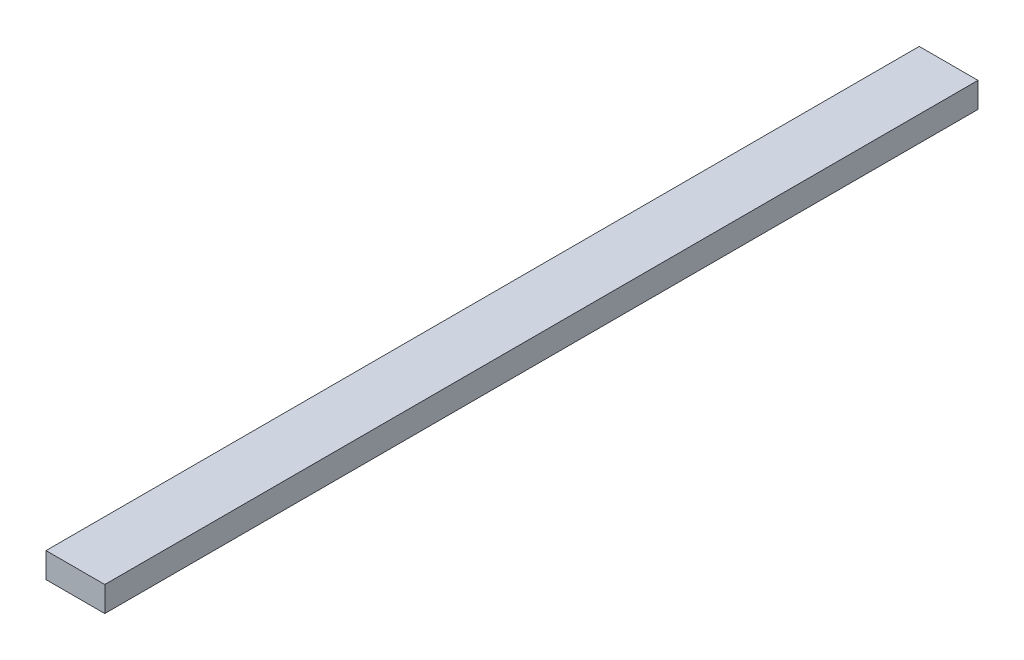
ISO-10303-21;
HEADER;
FILE_DESCRIPTION(('STEP AP214'),'2;1');
FILE_NAME('part.step','',(''),(''),'','','');
FILE_SCHEMA(('AUTOMOTIVE_DESIGN { 1 0 10303 214 1 1 1 1 }'));
ENDSEC;
DATA;
#1=APPLICATION_CONTEXT('core data for automotive mechanical design processes');
#2=APPLICATION_PROTOCOL_DEFINITION('international standard','automotive_design',2000,#1);
#3=PRODUCT_CONTEXT('',#1,'mechanical');
#4=PRODUCT('Part','Part','',(#3));
#5=PRODUCT_RELATED_PRODUCT_CATEGORY('part','',(#4));
#6=PRODUCT_DEFINITION_FORMATION('','',#4);
#7=PRODUCT_DEFINITION_CONTEXT('part definition',#1,'design');
#8=PRODUCT_DEFINITION('design','',#6,#7);
#9=PRODUCT_DEFINITION_SHAPE('','',#8);
#10=(LENGTH_UNIT() NAMED_UNIT(*) SI_UNIT(.MILLI.,.METRE.));
#11=(NAMED_UNIT(*) PLANE_ANGLE_UNIT() SI_UNIT($,.RADIAN.));
#12=(NAMED_UNIT(*) SI_UNIT($,.STERADIAN.) SOLID_ANGLE_UNIT());
#13=UNCERTAINTY_MEASURE_WITH_UNIT(LENGTH_MEASURE(1.E-05),#10,'distance_accuracy_value','');
#14=(GEOMETRIC_REPRESENTATION_CONTEXT(3) GLOBAL_UNCERTAINTY_ASSIGNED_CONTEXT((#13)) GLOBAL_UNIT_ASSIGNED_CONTEXT((#10,
#11,#12)) REPRESENTATION_CONTEXT('',''));
#15=CARTESIAN_POINT('',(0.,0.,0.));
#16=DIRECTION('',(0.,0.,1.));
#17=DIRECTION('',(1.,0.,0.));
#18=AXIS2_PLACEMENT_3D('',#15,#16,#17);
#19=CARTESIAN_POINT('',(-44.45,19.05,660.4));
#20=DIRECTION('',(1.,0.,0.));
#21=DIRECTION('',(0.,0.,-1.));
#22=AXIS2_PLACEMENT_3D('',#19,#20,#21);
#23=PLANE('',#22);
#24=DIRECTION('',(0.,-1.,0.));
#25=VECTOR('',#24,1.);
#26=CARTESIAN_POINT('',(-44.45,19.05,-660.4));
#27=LINE('',#26,#25);
#28=CARTESIAN_POINT('',(-44.45,19.05,-660.4));
#29=VERTEX_POINT('',#28);
#30=CARTESIAN_POINT('',(-44.45,-19.05,-660.4));
#31=VERTEX_POINT('',#30);
#32=EDGE_CURVE('E96',#29,#31,#27,.T.);
#33=ORIENTED_EDGE('',*,*,#32,.T.);
#34=DIRECTION('',(0.,0.,-1.));
#35=VECTOR('',#34,1.);
#36=CARTESIAN_POINT('',(-44.45,-19.05,660.4));
#37=LINE('',#36,#35);
#38=CARTESIAN_POINT('',(-44.45,-19.05,660.4));
#39=VERTEX_POINT('',#38);
#40=EDGE_CURVE('E11',#39,#31,#37,.T.);
#41=ORIENTED_EDGE('',*,*,#40,.F.);
#42=DIRECTION('',(0.,-1.,0.));
#43=VECTOR('',#42,1.);
#44=CARTESIAN_POINT('',(-44.45,19.05,660.4));
#45=LINE('',#44,#43);
#46=CARTESIAN_POINT('',(-44.45,19.05,660.4));
#47=VERTEX_POINT('',#46);
#48=EDGE_CURVE('E84',#47,#39,#45,.T.);
#49=ORIENTED_EDGE('',*,*,#48,.F.);
#50=DIRECTION('',(0.,0.,-1.));
#51=VECTOR('',#50,1.);
#52=CARTESIAN_POINT('',(-44.45,19.05,660.4));
#53=LINE('',#52,#51);
#54=EDGE_CURVE('E92',#47,#29,#53,.T.);
#55=ORIENTED_EDGE('',*,*,#54,.T.);
#56=EDGE_LOOP('',(#33,#41,#49,#55));
#57=FACE_BOUND('',#56,.T.);
#58=ADVANCED_FACE('F33',(#57),#23,.F.);
#59=CARTESIAN_POINT('',(44.45,-19.05,660.4));
#60=DIRECTION('',(0.,1.,0.));
#61=DIRECTION('',(-1.,0.,0.));
#62=AXIS2_PLACEMENT_3D('',#59,#60,#61);
#63=PLANE('',#62);
#64=DIRECTION('',(1.,0.,0.));
#65=VECTOR('',#64,1.);
#66=CARTESIAN_POINT('',(44.45,-19.05,-660.4));
#67=LINE('',#66,#65);
#68=CARTESIAN_POINT('',(44.45,-19.05,-660.4));
#69=VERTEX_POINT('',#68);
#70=EDGE_CURVE('E88',#31,#69,#67,.T.);
#71=ORIENTED_EDGE('',*,*,#70,.T.);
#72=DIRECTION('',(0.,0.,-1.));
#73=VECTOR('',#72,1.);
#74=CARTESIAN_POINT('',(44.45,-19.05,660.4));
#75=LINE('',#74,#73);
#76=CARTESIAN_POINT('',(44.45,-19.05,660.4));
#77=VERTEX_POINT('',#76);
#78=EDGE_CURVE('E41',#77,#69,#75,.T.);
#79=ORIENTED_EDGE('',*,*,#78,.F.);
#80=DIRECTION('',(1.,0.,0.));
#81=VECTOR('',#80,1.);
#82=CARTESIAN_POINT('',(44.45,-19.05,660.4));
#83=LINE('',#82,#81);
#84=EDGE_CURVE('E79',#39,#77,#83,.T.);
#85=ORIENTED_EDGE('',*,*,#84,.F.);
#86=ORIENTED_EDGE('',*,*,#40,.T.);
#87=EDGE_LOOP('',(#71,#79,#85,#86));
#88=FACE_BOUND('',#87,.T.);
#89=ADVANCED_FACE('F87',(#88),#63,.F.);
#90=CARTESIAN_POINT('',(44.45,19.05,660.4));
#91=DIRECTION('',(-1.,0.,0.));
#92=DIRECTION('',(0.,-1.,0.));
#93=AXIS2_PLACEMENT_3D('',#90,#91,#92);
#94=PLANE('',#93);
#95=DIRECTION('',(0.,1.,0.));
#96=VECTOR('',#95,1.);
#97=CARTESIAN_POINT('',(44.45,19.05,-660.4));
#98=LINE('',#97,#96);
#99=CARTESIAN_POINT('',(44.45,19.05,-660.4));
#100=VERTEX_POINT('',#99);
#101=EDGE_CURVE('E66',#69,#100,#98,.T.);
#102=ORIENTED_EDGE('',*,*,#101,.T.);
#103=DIRECTION('',(0.,0.,-1.));
#104=VECTOR('',#103,1.);
#105=CARTESIAN_POINT('',(44.45,19.05,660.4));
#106=LINE('',#105,#104);
#107=CARTESIAN_POINT('',(44.45,19.05,660.4));
#108=VERTEX_POINT('',#107);
#109=EDGE_CURVE('E89',#108,#100,#106,.T.);
#110=ORIENTED_EDGE('',*,*,#109,.F.);
#111=DIRECTION('',(0.,1.,0.));
#112=VECTOR('',#111,1.);
#113=CARTESIAN_POINT('',(44.45,19.05,660.4));
#114=LINE('',#113,#112);
#115=EDGE_CURVE('E82',#77,#108,#114,.T.);
#116=ORIENTED_EDGE('',*,*,#115,.F.);
#117=ORIENTED_EDGE('',*,*,#78,.T.);
#118=EDGE_LOOP('',(#102,#110,#116,#117));
#119=FACE_BOUND('',#118,.T.);
#120=ADVANCED_FACE('F90',(#119),#94,.F.);
#121=CARTESIAN_POINT('',(44.45,19.05,660.4));
#122=DIRECTION('',(0.,-1.,0.));
#123=DIRECTION('',(1.,0.,0.));
#124=AXIS2_PLACEMENT_3D('',#121,#122,#123);
#125=PLANE('',#124);
#126=DIRECTION('',(-1.,0.,0.));
#127=VECTOR('',#126,1.);
#128=CARTESIAN_POINT('',(44.45,19.05,-660.4));
#129=LINE('',#128,#127);
#130=EDGE_CURVE('E72',#100,#29,#129,.T.);
#131=ORIENTED_EDGE('',*,*,#130,.T.);
#132=ORIENTED_EDGE('',*,*,#54,.F.);
#133=DIRECTION('',(-1.,0.,0.));
#134=VECTOR('',#133,1.);
#135=CARTESIAN_POINT('',(44.45,19.05,660.4));
#136=LINE('',#135,#134);
#137=EDGE_CURVE('E49',#108,#47,#136,.T.);
#138=ORIENTED_EDGE('',*,*,#137,.F.);
#139=ORIENTED_EDGE('',*,*,#109,.T.);
#140=EDGE_LOOP('',(#131,#132,#138,#139));
#141=FACE_BOUND('',#140,.T.);
#142=ADVANCED_FACE('F103',(#141),#125,.F.);
#143=CARTESIAN_POINT('',(0.,0.,660.4));
#144=DIRECTION('',(0.,0.,-1.));
#145=DIRECTION('',(-1.,0.,0.));
#146=AXIS2_PLACEMENT_3D('',#143,#144,#145);
#147=PLANE('',#146);
#148=ORIENTED_EDGE('',*,*,#48,.T.);
#149=ORIENTED_EDGE('',*,*,#84,.T.);
#150=ORIENTED_EDGE('',*,*,#115,.T.);
#151=ORIENTED_EDGE('',*,*,#137,.T.);
#152=EDGE_LOOP('',(#148,#149,#150,#151));
#153=FACE_BOUND('',#152,.T.);
#154=ADVANCED_FACE('F80',(#153),#147,.F.);
#155=CARTESIAN_POINT('',(0.,0.,-660.4));
#156=DIRECTION('',(0.,0.,-1.));
#157=DIRECTION('',(-1.,0.,0.));
#158=AXIS2_PLACEMENT_3D('',#155,#156,#157);
#159=PLANE('',#158);
#160=ORIENTED_EDGE('',*,*,#32,.F.);
#161=ORIENTED_EDGE('',*,*,#130,.F.);
#162=ORIENTED_EDGE('',*,*,#101,.F.);
#163=ORIENTED_EDGE('',*,*,#70,.F.);
#164=EDGE_LOOP('',(#160,#161,#162,#163));
#165=FACE_BOUND('',#164,.T.);
#166=ADVANCED_FACE('F106',(#165),#159,.T.);
#167=CLOSED_SHELL('',(#58,#89,#120,#142,#154,#166));
#168=MANIFOLD_SOLID_BREP('B2',#167);
#169=ADVANCED_BREP_SHAPE_REPRESENTATION('',(#18,#168),#14);
#170=SHAPE_DEFINITION_REPRESENTATION(#9,#169);
ENDSEC;
END-ISO-10303-21;
